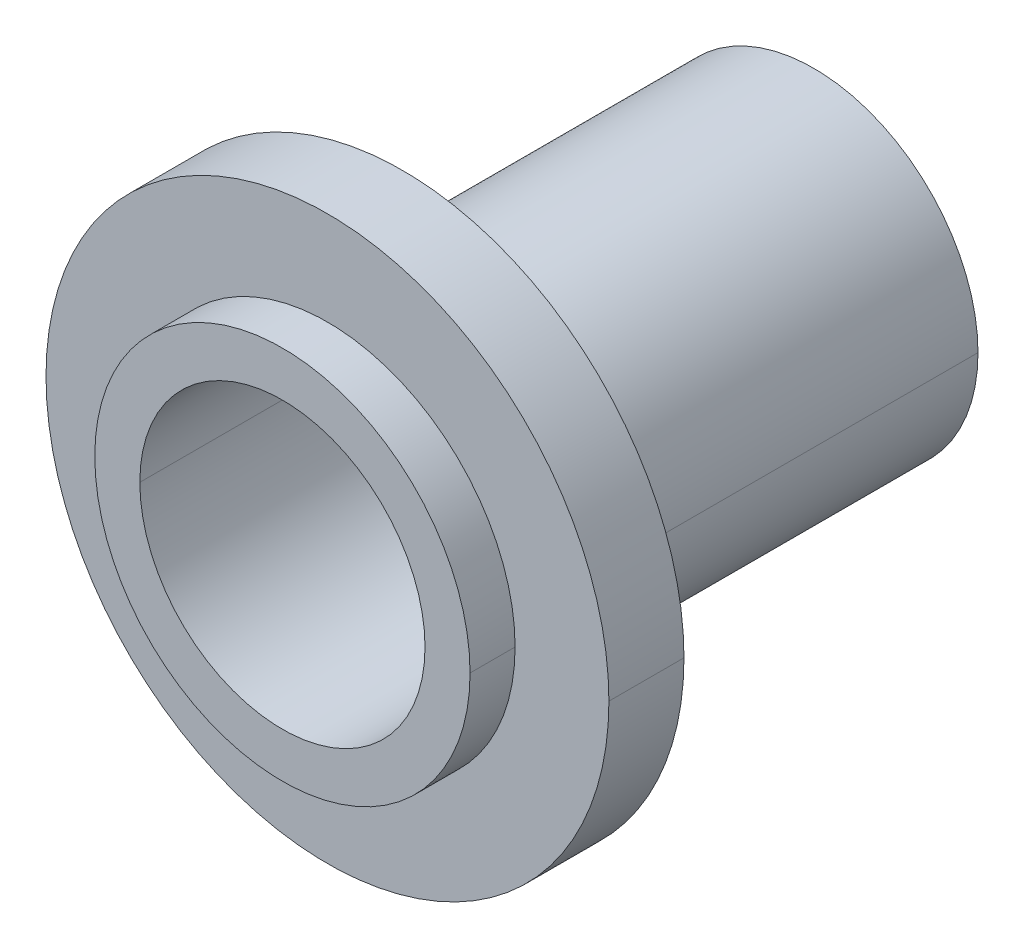
ISO-10303-21;
HEADER;
FILE_DESCRIPTION(('STEP AP214'),'2;1');
FILE_NAME('part.step','',(''),(''),'','','');
FILE_SCHEMA(('AUTOMOTIVE_DESIGN { 1 0 10303 214 1 1 1 1 }'));
ENDSEC;
DATA;
#1=APPLICATION_CONTEXT('core data for automotive mechanical design processes');
#2=APPLICATION_PROTOCOL_DEFINITION('international standard','automotive_design',2000,#1);
#3=PRODUCT_CONTEXT('',#1,'mechanical');
#4=PRODUCT('Part','Part','',(#3));
#5=PRODUCT_RELATED_PRODUCT_CATEGORY('part','',(#4));
#6=PRODUCT_DEFINITION_FORMATION('','',#4);
#7=PRODUCT_DEFINITION_CONTEXT('part definition',#1,'design');
#8=PRODUCT_DEFINITION('design','',#6,#7);
#9=PRODUCT_DEFINITION_SHAPE('','',#8);
#10=(LENGTH_UNIT() NAMED_UNIT(*) SI_UNIT(.MILLI.,.METRE.));
#11=(NAMED_UNIT(*) PLANE_ANGLE_UNIT() SI_UNIT($,.RADIAN.));
#12=(NAMED_UNIT(*) SI_UNIT($,.STERADIAN.) SOLID_ANGLE_UNIT());
#13=UNCERTAINTY_MEASURE_WITH_UNIT(LENGTH_MEASURE(1.E-05),#10,'distance_accuracy_value','');
#14=(GEOMETRIC_REPRESENTATION_CONTEXT(3) GLOBAL_UNCERTAINTY_ASSIGNED_CONTEXT((#13)) GLOBAL_UNIT_ASSIGNED_CONTEXT((#10,
#11,#12)) REPRESENTATION_CONTEXT('',''));
#15=CARTESIAN_POINT('',(0.,0.,0.));
#16=DIRECTION('',(0.,0.,1.));
#17=DIRECTION('',(1.,0.,0.));
#18=AXIS2_PLACEMENT_3D('',#15,#16,#17);
#19=CARTESIAN_POINT('',(0.,0.,-15.1892));
#20=DIRECTION('',(0.,0.,-1.));
#21=DIRECTION('',(0.,-1.,0.));
#22=AXIS2_PLACEMENT_3D('',#19,#20,#21);
#23=PLANE('',#22);
#24=CARTESIAN_POINT('',(0.,0.,-15.1892));
#25=DIRECTION('',(0.,0.,-1.));
#26=DIRECTION('',(-1.,0.,0.));
#27=AXIS2_PLACEMENT_3D('',#24,#25,#26);
#28=CIRCLE('',#27,4.826);
#29=CARTESIAN_POINT('',(-4.826,0.,-15.1892));
#30=VERTEX_POINT('',#29);
#31=CARTESIAN_POINT('',(4.826,0.,-15.1892));
#32=VERTEX_POINT('',#31);
#33=EDGE_CURVE('E156',#30,#32,#28,.T.);
#34=ORIENTED_EDGE('',*,*,#33,.F.);
#35=CARTESIAN_POINT('',(0.,0.,-15.1892));
#36=DIRECTION('',(0.,0.,-1.));
#37=DIRECTION('',(-1.,0.,0.));
#38=AXIS2_PLACEMENT_3D('',#35,#36,#37);
#39=CIRCLE('',#38,4.826);
#40=EDGE_CURVE('E145',#32,#30,#39,.T.);
#41=ORIENTED_EDGE('',*,*,#40,.F.);
#42=EDGE_LOOP('',(#34,#41));
#43=FACE_BOUND('',#42,.T.);
#44=CARTESIAN_POINT('',(0.,0.,-15.1892));
#45=DIRECTION('',(0.,0.,-1.));
#46=DIRECTION('',(-1.,0.,0.));
#47=AXIS2_PLACEMENT_3D('',#44,#45,#46);
#48=CIRCLE('',#47,5.55625);
#49=CARTESIAN_POINT('',(5.55625,0.,-15.1892));
#50=VERTEX_POINT('',#49);
#51=CARTESIAN_POINT('',(-5.55625,0.,-15.1892));
#52=VERTEX_POINT('',#51);
#53=EDGE_CURVE('E11',#50,#52,#48,.T.);
#54=ORIENTED_EDGE('',*,*,#53,.T.);
#55=CARTESIAN_POINT('',(0.,0.,-15.1892));
#56=DIRECTION('',(0.,0.,-1.));
#57=DIRECTION('',(-1.,0.,0.));
#58=AXIS2_PLACEMENT_3D('',#55,#56,#57);
#59=CIRCLE('',#58,5.55625);
#60=EDGE_CURVE('E101',#52,#50,#59,.T.);
#61=ORIENTED_EDGE('',*,*,#60,.T.);
#62=EDGE_LOOP('',(#54,#61));
#63=FACE_BOUND('',#62,.T.);
#64=ADVANCED_FACE('F16',(#43,#63),#23,.T.);
#65=CARTESIAN_POINT('',(0.,0.,-15.1892));
#66=DIRECTION('',(0.,0.,1.));
#67=DIRECTION('',(1.,0.,0.));
#68=AXIS2_PLACEMENT_3D('',#65,#66,#67);
#69=CYLINDRICAL_SURFACE('',#68,5.55625);
#70=DIRECTION('',(0.,0.,1.));
#71=VECTOR('',#70,1.);
#72=CARTESIAN_POINT('',(-5.55625,0.,-15.1892));
#73=LINE('',#72,#71);
#74=CARTESIAN_POINT('',(-5.55625,0.,-1.27));
#75=VERTEX_POINT('',#74);
#76=EDGE_CURVE('E107',#52,#75,#73,.T.);
#77=ORIENTED_EDGE('',*,*,#76,.F.);
#78=ORIENTED_EDGE('',*,*,#53,.F.);
#79=DIRECTION('',(0.,0.,1.));
#80=VECTOR('',#79,1.);
#81=CARTESIAN_POINT('',(5.55625,0.,-15.1892));
#82=LINE('',#81,#80);
#83=CARTESIAN_POINT('',(5.55625,0.,-1.27));
#84=VERTEX_POINT('',#83);
#85=EDGE_CURVE('E116',#50,#84,#82,.T.);
#86=ORIENTED_EDGE('',*,*,#85,.T.);
#87=CARTESIAN_POINT('',(0.,0.,-1.27));
#88=DIRECTION('',(0.,0.,-1.));
#89=DIRECTION('',(1.,0.,0.));
#90=AXIS2_PLACEMENT_3D('',#87,#88,#89);
#91=CIRCLE('',#90,5.55625);
#92=EDGE_CURVE('E108',#84,#75,#91,.T.);
#93=ORIENTED_EDGE('',*,*,#92,.T.);
#94=EDGE_LOOP('',(#77,#78,#86,#93));
#95=FACE_BOUND('',#94,.T.);
#96=ADVANCED_FACE('F18',(#95),#69,.T.);
#97=CARTESIAN_POINT('',(0.,0.,2.794));
#98=DIRECTION('',(0.,0.,-1.));
#99=DIRECTION('',(-1.,0.,0.));
#100=AXIS2_PLACEMENT_3D('',#97,#98,#99);
#101=CYLINDRICAL_SURFACE('',#100,6.35);
#102=DIRECTION('',(0.,0.,-1.));
#103=VECTOR('',#102,1.);
#104=CARTESIAN_POINT('',(6.35,0.,2.794));
#105=LINE('',#104,#103);
#106=CARTESIAN_POINT('',(6.35,0.,2.794));
#107=VERTEX_POINT('',#106);
#108=CARTESIAN_POINT('',(6.35,0.,1.27));
#109=VERTEX_POINT('',#108);
#110=EDGE_CURVE('E20',#107,#109,#105,.T.);
#111=ORIENTED_EDGE('',*,*,#110,.F.);
#112=CARTESIAN_POINT('',(0.,0.,2.794));
#113=DIRECTION('',(0.,0.,1.));
#114=DIRECTION('',(1.,0.,0.));
#115=AXIS2_PLACEMENT_3D('',#112,#113,#114);
#116=CIRCLE('',#115,6.35);
#117=CARTESIAN_POINT('',(-6.35,0.,2.794));
#118=VERTEX_POINT('',#117);
#119=EDGE_CURVE('E27',#118,#107,#116,.T.);
#120=ORIENTED_EDGE('',*,*,#119,.F.);
#121=DIRECTION('',(0.,0.,-1.));
#122=VECTOR('',#121,1.);
#123=CARTESIAN_POINT('',(-6.35,0.,2.794));
#124=LINE('',#123,#122);
#125=CARTESIAN_POINT('',(-6.35,0.,1.27));
#126=VERTEX_POINT('',#125);
#127=EDGE_CURVE('E129',#118,#126,#124,.T.);
#128=ORIENTED_EDGE('',*,*,#127,.T.);
#129=CARTESIAN_POINT('',(0.,0.,1.27));
#130=DIRECTION('',(0.,0.,1.));
#131=DIRECTION('',(1.,0.,0.));
#132=AXIS2_PLACEMENT_3D('',#129,#130,#131);
#133=CIRCLE('',#132,6.35);
#134=EDGE_CURVE('E159',#126,#109,#133,.T.);
#135=ORIENTED_EDGE('',*,*,#134,.T.);
#136=EDGE_LOOP('',(#111,#120,#128,#135));
#137=FACE_BOUND('',#136,.T.);
#138=ADVANCED_FACE('F223',(#137),#101,.T.);
#139=CARTESIAN_POINT('',(0.,0.,2.794));
#140=DIRECTION('',(0.,0.,1.));
#141=DIRECTION('',(1.,0.,0.));
#142=AXIS2_PLACEMENT_3D('',#139,#140,#141);
#143=PLANE('',#142);
#144=CARTESIAN_POINT('',(0.,0.,2.794));
#145=DIRECTION('',(0.,0.,1.));
#146=DIRECTION('',(1.,0.,0.));
#147=AXIS2_PLACEMENT_3D('',#144,#145,#146);
#148=CIRCLE('',#147,4.826);
#149=CARTESIAN_POINT('',(-4.826,0.,2.794));
#150=VERTEX_POINT('',#149);
#151=CARTESIAN_POINT('',(4.826,0.,2.794));
#152=VERTEX_POINT('',#151);
#153=EDGE_CURVE('E127',#150,#152,#148,.T.);
#154=ORIENTED_EDGE('',*,*,#153,.F.);
#155=CARTESIAN_POINT('',(0.,0.,2.794));
#156=DIRECTION('',(0.,0.,1.));
#157=DIRECTION('',(1.,0.,0.));
#158=AXIS2_PLACEMENT_3D('',#155,#156,#157);
#159=CIRCLE('',#158,4.826);
#160=EDGE_CURVE('E157',#152,#150,#159,.T.);
#161=ORIENTED_EDGE('',*,*,#160,.F.);
#162=EDGE_LOOP('',(#154,#161));
#163=FACE_BOUND('',#162,.T.);
#164=ORIENTED_EDGE('',*,*,#119,.T.);
#165=CARTESIAN_POINT('',(0.,0.,2.794));
#166=DIRECTION('',(0.,0.,1.));
#167=DIRECTION('',(1.,0.,0.));
#168=AXIS2_PLACEMENT_3D('',#165,#166,#167);
#169=CIRCLE('',#168,6.35);
#170=EDGE_CURVE('E131',#107,#118,#169,.T.);
#171=ORIENTED_EDGE('',*,*,#170,.T.);
#172=EDGE_LOOP('',(#164,#171));
#173=FACE_BOUND('',#172,.T.);
#174=ADVANCED_FACE('F238',(#163,#173),#143,.T.);
#175=CARTESIAN_POINT('',(0.,0.,1.27));
#176=DIRECTION('',(0.,0.,-1.));
#177=DIRECTION('',(-1.,0.,0.));
#178=AXIS2_PLACEMENT_3D('',#175,#176,#177);
#179=CYLINDRICAL_SURFACE('',#178,4.826);
#180=DIRECTION('',(0.,0.,-1.));
#181=VECTOR('',#180,1.);
#182=CARTESIAN_POINT('',(4.826,0.,1.27));
#183=LINE('',#182,#181);
#184=EDGE_CURVE('E125',#152,#32,#183,.T.);
#185=ORIENTED_EDGE('',*,*,#184,.F.);
#186=ORIENTED_EDGE('',*,*,#160,.T.);
#187=DIRECTION('',(0.,0.,-1.));
#188=VECTOR('',#187,1.);
#189=CARTESIAN_POINT('',(-4.826,0.,1.27));
#190=LINE('',#189,#188);
#191=EDGE_CURVE('E140',#150,#30,#190,.T.);
#192=ORIENTED_EDGE('',*,*,#191,.T.);
#193=ORIENTED_EDGE('',*,*,#33,.T.);
#194=EDGE_LOOP('',(#185,#186,#192,#193));
#195=FACE_BOUND('',#194,.T.);
#196=ADVANCED_FACE('F301',(#195),#179,.F.);
#197=CARTESIAN_POINT('',(0.,0.,1.27));
#198=DIRECTION('',(0.,0.,-1.));
#199=DIRECTION('',(-1.,0.,0.));
#200=AXIS2_PLACEMENT_3D('',#197,#198,#199);
#201=CYLINDRICAL_SURFACE('',#200,9.525);
#202=DIRECTION('',(0.,0.,-1.));
#203=VECTOR('',#202,1.);
#204=CARTESIAN_POINT('',(9.525,0.,1.27));
#205=LINE('',#204,#203);
#206=CARTESIAN_POINT('',(9.525,0.,1.27));
#207=VERTEX_POINT('',#206);
#208=CARTESIAN_POINT('',(9.525,0.,-1.27));
#209=VERTEX_POINT('',#208);
#210=EDGE_CURVE('E185',#207,#209,#205,.T.);
#211=ORIENTED_EDGE('',*,*,#210,.F.);
#212=CARTESIAN_POINT('',(0.,0.,1.27));
#213=DIRECTION('',(0.,0.,1.));
#214=DIRECTION('',(1.,0.,0.));
#215=AXIS2_PLACEMENT_3D('',#212,#213,#214);
#216=CIRCLE('',#215,9.525);
#217=CARTESIAN_POINT('',(-9.525,0.,1.27));
#218=VERTEX_POINT('',#217);
#219=EDGE_CURVE('E153',#218,#207,#216,.T.);
#220=ORIENTED_EDGE('',*,*,#219,.F.);
#221=DIRECTION('',(0.,0.,-1.));
#222=VECTOR('',#221,1.);
#223=CARTESIAN_POINT('',(-9.525,0.,1.27));
#224=LINE('',#223,#222);
#225=CARTESIAN_POINT('',(-9.525,0.,-1.27));
#226=VERTEX_POINT('',#225);
#227=EDGE_CURVE('E137',#218,#226,#224,.T.);
#228=ORIENTED_EDGE('',*,*,#227,.T.);
#229=CARTESIAN_POINT('',(0.,0.,-1.27));
#230=DIRECTION('',(0.,0.,1.));
#231=DIRECTION('',(1.,0.,0.));
#232=AXIS2_PLACEMENT_3D('',#229,#230,#231);
#233=CIRCLE('',#232,9.525);
#234=EDGE_CURVE('E41',#226,#209,#233,.T.);
#235=ORIENTED_EDGE('',*,*,#234,.T.);
#236=EDGE_LOOP('',(#211,#220,#228,#235));
#237=FACE_BOUND('',#236,.T.);
#238=ADVANCED_FACE('F197',(#237),#201,.T.);
#239=CARTESIAN_POINT('',(0.,0.,1.27));
#240=DIRECTION('',(0.,0.,1.));
#241=DIRECTION('',(1.,0.,0.));
#242=AXIS2_PLACEMENT_3D('',#239,#240,#241);
#243=PLANE('',#242);
#244=ORIENTED_EDGE('',*,*,#134,.F.);
#245=CARTESIAN_POINT('',(0.,0.,1.27));
#246=DIRECTION('',(0.,0.,1.));
#247=DIRECTION('',(1.,0.,0.));
#248=AXIS2_PLACEMENT_3D('',#245,#246,#247);
#249=CIRCLE('',#248,6.35);
#250=EDGE_CURVE('E189',#109,#126,#249,.T.);
#251=ORIENTED_EDGE('',*,*,#250,.F.);
#252=EDGE_LOOP('',(#244,#251));
#253=FACE_BOUND('',#252,.T.);
#254=ORIENTED_EDGE('',*,*,#219,.T.);
#255=CARTESIAN_POINT('',(0.,0.,1.27));
#256=DIRECTION('',(0.,0.,1.));
#257=DIRECTION('',(1.,0.,0.));
#258=AXIS2_PLACEMENT_3D('',#255,#256,#257);
#259=CIRCLE('',#258,9.525);
#260=EDGE_CURVE('E144',#207,#218,#259,.T.);
#261=ORIENTED_EDGE('',*,*,#260,.T.);
#262=EDGE_LOOP('',(#254,#261));
#263=FACE_BOUND('',#262,.T.);
#264=ADVANCED_FACE('F203',(#253,#263),#243,.T.);
#265=CARTESIAN_POINT('',(0.,0.,-1.27));
#266=DIRECTION('',(0.,0.,1.));
#267=DIRECTION('',(1.,0.,0.));
#268=AXIS2_PLACEMENT_3D('',#265,#266,#267);
#269=PLANE('',#268);
#270=ORIENTED_EDGE('',*,*,#92,.F.);
#271=CARTESIAN_POINT('',(0.,0.,-1.27));
#272=DIRECTION('',(0.,0.,-1.));
#273=DIRECTION('',(1.,0.,0.));
#274=AXIS2_PLACEMENT_3D('',#271,#272,#273);
#275=CIRCLE('',#274,5.55625);
#276=EDGE_CURVE('E113',#75,#84,#275,.T.);
#277=ORIENTED_EDGE('',*,*,#276,.F.);
#278=EDGE_LOOP('',(#270,#277));
#279=FACE_BOUND('',#278,.T.);
#280=ORIENTED_EDGE('',*,*,#234,.F.);
#281=CARTESIAN_POINT('',(0.,0.,-1.27));
#282=DIRECTION('',(0.,0.,1.));
#283=DIRECTION('',(1.,0.,0.));
#284=AXIS2_PLACEMENT_3D('',#281,#282,#283);
#285=CIRCLE('',#284,9.525);
#286=EDGE_CURVE('E181',#209,#226,#285,.T.);
#287=ORIENTED_EDGE('',*,*,#286,.F.);
#288=EDGE_LOOP('',(#280,#287));
#289=FACE_BOUND('',#288,.T.);
#290=ADVANCED_FACE('F201',(#279,#289),#269,.F.);
#291=CARTESIAN_POINT('',(0.,0.,1.27));
#292=DIRECTION('',(0.,0.,-1.));
#293=DIRECTION('',(-1.,0.,0.));
#294=AXIS2_PLACEMENT_3D('',#291,#292,#293);
#295=CYLINDRICAL_SURFACE('',#294,9.525);
#296=ORIENTED_EDGE('',*,*,#260,.F.);
#297=ORIENTED_EDGE('',*,*,#210,.T.);
#298=ORIENTED_EDGE('',*,*,#286,.T.);
#299=ORIENTED_EDGE('',*,*,#227,.F.);
#300=EDGE_LOOP('',(#296,#297,#298,#299));
#301=FACE_BOUND('',#300,.T.);
#302=ADVANCED_FACE('F200',(#301),#295,.T.);
#303=CARTESIAN_POINT('',(0.,0.,1.27));
#304=DIRECTION('',(0.,0.,-1.));
#305=DIRECTION('',(-1.,0.,0.));
#306=AXIS2_PLACEMENT_3D('',#303,#304,#305);
#307=CYLINDRICAL_SURFACE('',#306,4.826);
#308=ORIENTED_EDGE('',*,*,#153,.T.);
#309=ORIENTED_EDGE('',*,*,#184,.T.);
#310=ORIENTED_EDGE('',*,*,#40,.T.);
#311=ORIENTED_EDGE('',*,*,#191,.F.);
#312=EDGE_LOOP('',(#308,#309,#310,#311));
#313=FACE_BOUND('',#312,.T.);
#314=ADVANCED_FACE('F211',(#313),#307,.F.);
#315=CARTESIAN_POINT('',(0.,0.,2.794));
#316=DIRECTION('',(0.,0.,-1.));
#317=DIRECTION('',(-1.,0.,0.));
#318=AXIS2_PLACEMENT_3D('',#315,#316,#317);
#319=CYLINDRICAL_SURFACE('',#318,6.35);
#320=ORIENTED_EDGE('',*,*,#170,.F.);
#321=ORIENTED_EDGE('',*,*,#110,.T.);
#322=ORIENTED_EDGE('',*,*,#250,.T.);
#323=ORIENTED_EDGE('',*,*,#127,.F.);
#324=EDGE_LOOP('',(#320,#321,#322,#323));
#325=FACE_BOUND('',#324,.T.);
#326=ADVANCED_FACE('F225',(#325),#319,.T.);
#327=CARTESIAN_POINT('',(0.,0.,-15.1892));
#328=DIRECTION('',(0.,0.,1.));
#329=DIRECTION('',(1.,0.,0.));
#330=AXIS2_PLACEMENT_3D('',#327,#328,#329);
#331=CYLINDRICAL_SURFACE('',#330,5.55625);
#332=ORIENTED_EDGE('',*,*,#60,.F.);
#333=ORIENTED_EDGE('',*,*,#76,.T.);
#334=ORIENTED_EDGE('',*,*,#276,.T.);
#335=ORIENTED_EDGE('',*,*,#85,.F.);
#336=EDGE_LOOP('',(#332,#333,#334,#335));
#337=FACE_BOUND('',#336,.T.);
#338=ADVANCED_FACE('F115',(#337),#331,.T.);
#339=CLOSED_SHELL('',(#64,#96,#138,#174,#196,#238,#264,#290,#302,#314,#326,#338));
#340=MANIFOLD_SOLID_BREP('B1',#339);
#341=ADVANCED_BREP_SHAPE_REPRESENTATION('',(#18,#340),#14);
#342=SHAPE_DEFINITION_REPRESENTATION(#9,#341);
ENDSEC;
END-ISO-10303-21;
